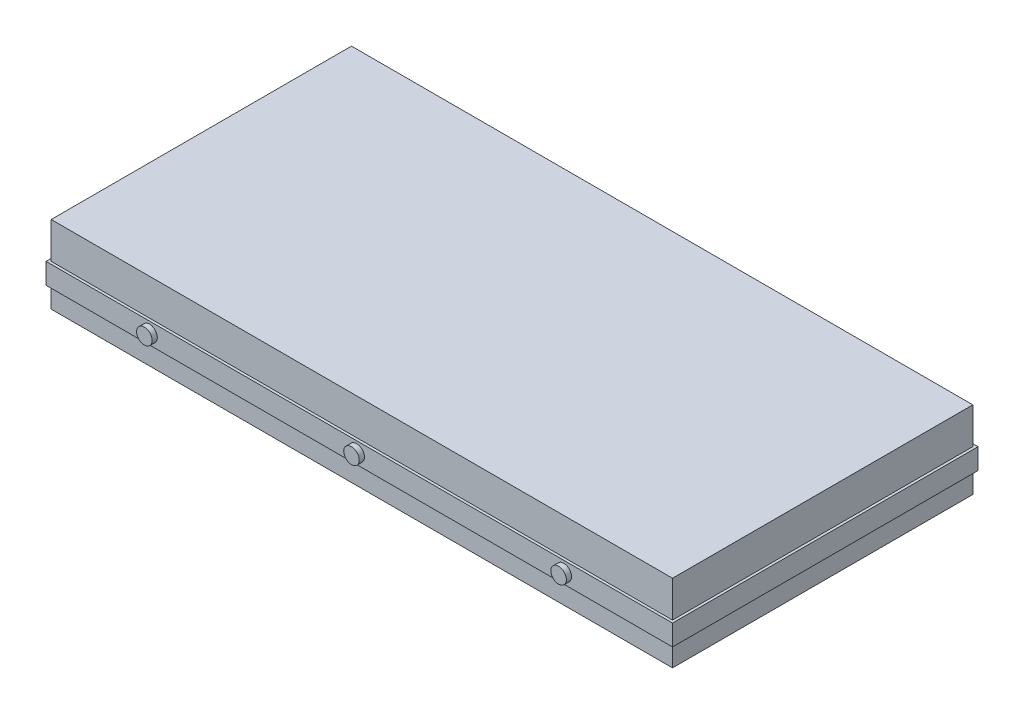
ISO-10303-21;
HEADER;
FILE_DESCRIPTION(('STEP AP214'),'2;1');
FILE_NAME('part.step','',(''),(''),'','','');
FILE_SCHEMA(('AUTOMOTIVE_DESIGN { 1 0 10303 214 1 1 1 1 }'));
ENDSEC;
DATA;
#1=APPLICATION_CONTEXT('core data for automotive mechanical design processes');
#2=APPLICATION_PROTOCOL_DEFINITION('international standard','automotive_design',2000,#1);
#3=PRODUCT_CONTEXT('',#1,'mechanical');
#4=PRODUCT('Part','Part','',(#3));
#5=PRODUCT_RELATED_PRODUCT_CATEGORY('part','',(#4));
#6=PRODUCT_DEFINITION_FORMATION('','',#4);
#7=PRODUCT_DEFINITION_CONTEXT('part definition',#1,'design');
#8=PRODUCT_DEFINITION('design','',#6,#7);
#9=PRODUCT_DEFINITION_SHAPE('','',#8);
#10=(LENGTH_UNIT() NAMED_UNIT(*) SI_UNIT(.MILLI.,.METRE.));
#11=(NAMED_UNIT(*) PLANE_ANGLE_UNIT() SI_UNIT($,.RADIAN.));
#12=(NAMED_UNIT(*) SI_UNIT($,.STERADIAN.) SOLID_ANGLE_UNIT());
#13=UNCERTAINTY_MEASURE_WITH_UNIT(LENGTH_MEASURE(1.E-05),#10,'distance_accuracy_value','');
#14=(GEOMETRIC_REPRESENTATION_CONTEXT(3) GLOBAL_UNCERTAINTY_ASSIGNED_CONTEXT((#13)) GLOBAL_UNIT_ASSIGNED_CONTEXT((#10,
#11,#12)) REPRESENTATION_CONTEXT('',''));
#15=CARTESIAN_POINT('',(0.,0.,0.));
#16=DIRECTION('',(0.,0.,1.));
#17=DIRECTION('',(1.,0.,0.));
#18=AXIS2_PLACEMENT_3D('',#15,#16,#17);
#19=CARTESIAN_POINT('',(995.,60.,15.));
#20=DIRECTION('',(0.,0.,1.));
#21=DIRECTION('',(1.,0.,0.));
#22=AXIS2_PLACEMENT_3D('',#19,#20,#21);
#23=PLANE('',#22);
#24=CARTESIAN_POINT('',(995.,60.,15.));
#25=DIRECTION('',(0.,0.,1.));
#26=DIRECTION('',(1.,0.,0.));
#27=AXIS2_PLACEMENT_3D('',#24,#25,#26);
#28=CIRCLE('',#27,15.);
#29=CARTESIAN_POINT('',(1010.,60.,15.));
#30=VERTEX_POINT('',#29);
#31=EDGE_CURVE('E11',#30,#30,#28,.T.);
#32=ORIENTED_EDGE('',*,*,#31,.T.);
#33=EDGE_LOOP('',(#32));
#34=FACE_BOUND('',#33,.T.);
#35=ADVANCED_FACE('F38',(#34),#23,.T.);
#36=CARTESIAN_POINT('',(995.,60.,15.));
#37=DIRECTION('',(0.,0.,-1.));
#38=DIRECTION('',(-1.,0.,0.));
#39=AXIS2_PLACEMENT_3D('',#36,#37,#38);
#40=CYLINDRICAL_SURFACE('',#39,15.);
#41=ORIENTED_EDGE('',*,*,#31,.F.);
#42=EDGE_LOOP('',(#41));
#43=FACE_BOUND('',#42,.T.);
#44=CARTESIAN_POINT('',(995.,60.,5.));
#45=DIRECTION('',(0.,0.,-1.));
#46=DIRECTION('',(-1.,0.,0.));
#47=AXIS2_PLACEMENT_3D('',#44,#45,#46);
#48=CIRCLE('',#47,15.);
#49=CARTESIAN_POINT('',(980.,60.,5.));
#50=VERTEX_POINT('',#49);
#51=EDGE_CURVE('E45',#50,#50,#48,.F.);
#52=ORIENTED_EDGE('',*,*,#51,.T.);
#53=EDGE_LOOP('',(#52));
#54=FACE_BOUND('',#53,.T.);
#55=ADVANCED_FACE('F165',(#43,#54),#40,.T.);
#56=CARTESIAN_POINT('',(1200.,150.,0.));
#57=DIRECTION('',(0.,0.,-1.));
#58=DIRECTION('',(-1.,0.,0.));
#59=AXIS2_PLACEMENT_3D('',#56,#57,#58);
#60=PLANE('',#59);
#61=DIRECTION('',(0.,-1.,0.));
#62=VECTOR('',#61,1.);
#63=CARTESIAN_POINT('',(0.,150.,0.));
#64=LINE('',#63,#62);
#65=CARTESIAN_POINT('',(0.,150.,0.));
#66=VERTEX_POINT('',#65);
#67=CARTESIAN_POINT('',(0.,80.,0.));
#68=VERTEX_POINT('',#67);
#69=EDGE_CURVE('E145',#66,#68,#64,.T.);
#70=ORIENTED_EDGE('',*,*,#69,.T.);
#71=DIRECTION('',(1.,0.,0.));
#72=VECTOR('',#71,1.);
#73=CARTESIAN_POINT('',(0.,80.,0.));
#74=LINE('',#73,#72);
#75=CARTESIAN_POINT('',(1200.,80.,0.));
#76=VERTEX_POINT('',#75);
#77=EDGE_CURVE('E129',#68,#76,#74,.T.);
#78=ORIENTED_EDGE('',*,*,#77,.T.);
#79=DIRECTION('',(0.,-1.,0.));
#80=VECTOR('',#79,1.);
#81=CARTESIAN_POINT('',(1200.,150.,0.));
#82=LINE('',#81,#80);
#83=CARTESIAN_POINT('',(1200.,150.,0.));
#84=VERTEX_POINT('',#83);
#85=EDGE_CURVE('E143',#84,#76,#82,.T.);
#86=ORIENTED_EDGE('',*,*,#85,.F.);
#87=DIRECTION('',(1.,0.,0.));
#88=VECTOR('',#87,1.);
#89=CARTESIAN_POINT('',(1200.,150.,0.));
#90=LINE('',#89,#88);
#91=EDGE_CURVE('E271',#66,#84,#90,.T.);
#92=ORIENTED_EDGE('',*,*,#91,.F.);
#93=EDGE_LOOP('',(#70,#78,#86,#92));
#94=FACE_BOUND('',#93,.T.);
#95=ADVANCED_FACE('F141',(#94),#60,.F.);
#96=CARTESIAN_POINT('',(1200.,150.,0.));
#97=DIRECTION('',(-1.,0.,0.));
#98=DIRECTION('',(0.,0.,1.));
#99=AXIS2_PLACEMENT_3D('',#96,#97,#98);
#100=PLANE('',#99);
#101=ORIENTED_EDGE('',*,*,#85,.T.);
#102=DIRECTION('',(0.,0.,-1.));
#103=VECTOR('',#102,1.);
#104=CARTESIAN_POINT('',(1200.,80.,-580.));
#105=LINE('',#104,#103);
#106=CARTESIAN_POINT('',(1200.,80.,-580.));
#107=VERTEX_POINT('',#106);
#108=EDGE_CURVE('E126',#76,#107,#105,.T.);
#109=ORIENTED_EDGE('',*,*,#108,.T.);
#110=DIRECTION('',(0.,-1.,0.));
#111=VECTOR('',#110,1.);
#112=CARTESIAN_POINT('',(1200.,150.,-580.));
#113=LINE('',#112,#111);
#114=CARTESIAN_POINT('',(1200.,150.,-580.));
#115=VERTEX_POINT('',#114);
#116=EDGE_CURVE('E157',#115,#107,#113,.T.);
#117=ORIENTED_EDGE('',*,*,#116,.F.);
#118=DIRECTION('',(0.,0.,-1.));
#119=VECTOR('',#118,1.);
#120=CARTESIAN_POINT('',(1200.,150.,0.));
#121=LINE('',#120,#119);
#122=EDGE_CURVE('E149',#84,#115,#121,.T.);
#123=ORIENTED_EDGE('',*,*,#122,.F.);
#124=EDGE_LOOP('',(#101,#109,#117,#123));
#125=FACE_BOUND('',#124,.T.);
#126=ADVANCED_FACE('F148',(#125),#100,.F.);
#127=CARTESIAN_POINT('',(0.,150.,-580.));
#128=DIRECTION('',(0.,0.,1.));
#129=DIRECTION('',(1.,0.,0.));
#130=AXIS2_PLACEMENT_3D('',#127,#128,#129);
#131=PLANE('',#130);
#132=ORIENTED_EDGE('',*,*,#116,.T.);
#133=DIRECTION('',(-1.,0.,0.));
#134=VECTOR('',#133,1.);
#135=CARTESIAN_POINT('',(1200.,80.,-580.));
#136=LINE('',#135,#134);
#137=CARTESIAN_POINT('',(0.,80.,-580.));
#138=VERTEX_POINT('',#137);
#139=EDGE_CURVE('E132',#107,#138,#136,.T.);
#140=ORIENTED_EDGE('',*,*,#139,.T.);
#141=DIRECTION('',(0.,-1.,0.));
#142=VECTOR('',#141,1.);
#143=CARTESIAN_POINT('',(0.,150.,-580.));
#144=LINE('',#143,#142);
#145=CARTESIAN_POINT('',(0.,150.,-580.));
#146=VERTEX_POINT('',#145);
#147=EDGE_CURVE('E291',#146,#138,#144,.T.);
#148=ORIENTED_EDGE('',*,*,#147,.F.);
#149=DIRECTION('',(-1.,0.,0.));
#150=VECTOR('',#149,1.);
#151=CARTESIAN_POINT('',(0.,150.,-580.));
#152=LINE('',#151,#150);
#153=EDGE_CURVE('E275',#115,#146,#152,.T.);
#154=ORIENTED_EDGE('',*,*,#153,.F.);
#155=EDGE_LOOP('',(#132,#140,#148,#154));
#156=FACE_BOUND('',#155,.T.);
#157=ADVANCED_FACE('F201',(#156),#131,.F.);
#158=CARTESIAN_POINT('',(0.,150.,0.));
#159=DIRECTION('',(1.,0.,0.));
#160=DIRECTION('',(0.,0.,-1.));
#161=AXIS2_PLACEMENT_3D('',#158,#159,#160);
#162=PLANE('',#161);
#163=ORIENTED_EDGE('',*,*,#147,.T.);
#164=DIRECTION('',(0.,0.,1.));
#165=VECTOR('',#164,1.);
#166=CARTESIAN_POINT('',(0.,80.,-580.));
#167=LINE('',#166,#165);
#168=EDGE_CURVE('E146',#138,#68,#167,.T.);
#169=ORIENTED_EDGE('',*,*,#168,.T.);
#170=ORIENTED_EDGE('',*,*,#69,.F.);
#171=DIRECTION('',(0.,0.,1.));
#172=VECTOR('',#171,1.);
#173=CARTESIAN_POINT('',(0.,150.,0.));
#174=LINE('',#173,#172);
#175=EDGE_CURVE('E277',#146,#66,#174,.T.);
#176=ORIENTED_EDGE('',*,*,#175,.F.);
#177=EDGE_LOOP('',(#163,#169,#170,#176));
#178=FACE_BOUND('',#177,.T.);
#179=ADVANCED_FACE('F205',(#178),#162,.F.);
#180=CARTESIAN_POINT('',(0.,150.,0.));
#181=DIRECTION('',(0.,-1.,0.));
#182=DIRECTION('',(0.,0.,-1.));
#183=AXIS2_PLACEMENT_3D('',#180,#181,#182);
#184=PLANE('',#183);
#185=ORIENTED_EDGE('',*,*,#91,.T.);
#186=ORIENTED_EDGE('',*,*,#122,.T.);
#187=ORIENTED_EDGE('',*,*,#153,.T.);
#188=ORIENTED_EDGE('',*,*,#175,.T.);
#189=EDGE_LOOP('',(#185,#186,#187,#188));
#190=FACE_BOUND('',#189,.T.);
#191=ADVANCED_FACE('F209',(#190),#184,.F.);
#192=CARTESIAN_POINT('',(0.,80.,0.));
#193=DIRECTION('',(0.,1.,0.));
#194=DIRECTION('',(0.,0.,1.));
#195=AXIS2_PLACEMENT_3D('',#192,#193,#194);
#196=PLANE('',#195);
#197=DIRECTION('',(0.,0.,-1.));
#198=VECTOR('',#197,1.);
#199=CARTESIAN_POINT('',(1205.,80.,-585.));
#200=LINE('',#199,#198);
#201=CARTESIAN_POINT('',(1205.,80.,5.));
#202=VERTEX_POINT('',#201);
#203=CARTESIAN_POINT('',(1205.,80.,-585.));
#204=VERTEX_POINT('',#203);
#205=EDGE_CURVE('E260',#202,#204,#200,.T.);
#206=ORIENTED_EDGE('',*,*,#205,.T.);
#207=DIRECTION('',(-1.,0.,0.));
#208=VECTOR('',#207,1.);
#209=CARTESIAN_POINT('',(1205.,80.,-585.));
#210=LINE('',#209,#208);
#211=CARTESIAN_POINT('',(-5.,80.,-585.));
#212=VERTEX_POINT('',#211);
#213=EDGE_CURVE('E319',#204,#212,#210,.T.);
#214=ORIENTED_EDGE('',*,*,#213,.T.);
#215=DIRECTION('',(0.,0.,1.));
#216=VECTOR('',#215,1.);
#217=CARTESIAN_POINT('',(-5.,80.,-585.));
#218=LINE('',#217,#216);
#219=CARTESIAN_POINT('',(-5.,80.,5.));
#220=VERTEX_POINT('',#219);
#221=EDGE_CURVE('E253',#212,#220,#218,.T.);
#222=ORIENTED_EDGE('',*,*,#221,.T.);
#223=DIRECTION('',(1.,0.,0.));
#224=VECTOR('',#223,1.);
#225=CARTESIAN_POINT('',(-5.,80.,5.));
#226=LINE('',#225,#224);
#227=EDGE_CURVE('E267',#220,#202,#226,.T.);
#228=ORIENTED_EDGE('',*,*,#227,.T.);
#229=EDGE_LOOP('',(#206,#214,#222,#228));
#230=FACE_BOUND('',#229,.T.);
#231=ORIENTED_EDGE('',*,*,#77,.F.);
#232=ORIENTED_EDGE('',*,*,#168,.F.);
#233=ORIENTED_EDGE('',*,*,#139,.F.);
#234=ORIENTED_EDGE('',*,*,#108,.F.);
#235=EDGE_LOOP('',(#231,#232,#233,#234));
#236=FACE_BOUND('',#235,.T.);
#237=ADVANCED_FACE('F128',(#230,#236),#196,.T.);
#238=CARTESIAN_POINT('',(0.,40.,0.));
#239=DIRECTION('',(0.,1.,0.));
#240=DIRECTION('',(0.,0.,1.));
#241=AXIS2_PLACEMENT_3D('',#238,#239,#240);
#242=PLANE('',#241);
#243=DIRECTION('',(0.,0.,-1.));
#244=VECTOR('',#243,1.);
#245=CARTESIAN_POINT('',(1205.,40.,-585.));
#246=LINE('',#245,#244);
#247=CARTESIAN_POINT('',(1205.,40.,5.));
#248=VERTEX_POINT('',#247);
#249=CARTESIAN_POINT('',(1205.,40.,-585.));
#250=VERTEX_POINT('',#249);
#251=EDGE_CURVE('E249',#248,#250,#246,.T.);
#252=ORIENTED_EDGE('',*,*,#251,.F.);
#253=DIRECTION('',(1.,0.,0.));
#254=VECTOR('',#253,1.);
#255=CARTESIAN_POINT('',(-5.,40.,5.));
#256=LINE('',#255,#254);
#257=CARTESIAN_POINT('',(-5.,40.,5.));
#258=VERTEX_POINT('',#257);
#259=EDGE_CURVE('E258',#258,#248,#256,.T.);
#260=ORIENTED_EDGE('',*,*,#259,.F.);
#261=DIRECTION('',(0.,0.,1.));
#262=VECTOR('',#261,1.);
#263=CARTESIAN_POINT('',(-5.,40.,-585.));
#264=LINE('',#263,#262);
#265=CARTESIAN_POINT('',(-5.,40.,-585.));
#266=VERTEX_POINT('',#265);
#267=EDGE_CURVE('E248',#266,#258,#264,.T.);
#268=ORIENTED_EDGE('',*,*,#267,.F.);
#269=DIRECTION('',(-1.,0.,0.));
#270=VECTOR('',#269,1.);
#271=CARTESIAN_POINT('',(1205.,40.,-585.));
#272=LINE('',#271,#270);
#273=EDGE_CURVE('E238',#250,#266,#272,.T.);
#274=ORIENTED_EDGE('',*,*,#273,.F.);
#275=EDGE_LOOP('',(#252,#260,#268,#274));
#276=FACE_BOUND('',#275,.T.);
#277=DIRECTION('',(0.,0.,1.));
#278=VECTOR('',#277,1.);
#279=CARTESIAN_POINT('',(0.,40.,-580.));
#280=LINE('',#279,#278);
#281=CARTESIAN_POINT('',(0.,40.,-580.));
#282=VERTEX_POINT('',#281);
#283=CARTESIAN_POINT('',(0.,40.,0.));
#284=VERTEX_POINT('',#283);
#285=EDGE_CURVE('E300',#282,#284,#280,.T.);
#286=ORIENTED_EDGE('',*,*,#285,.T.);
#287=DIRECTION('',(1.,0.,0.));
#288=VECTOR('',#287,1.);
#289=CARTESIAN_POINT('',(0.,40.,0.));
#290=LINE('',#289,#288);
#291=CARTESIAN_POINT('',(1200.,40.,0.));
#292=VERTEX_POINT('',#291);
#293=EDGE_CURVE('E306',#284,#292,#290,.T.);
#294=ORIENTED_EDGE('',*,*,#293,.T.);
#295=DIRECTION('',(0.,0.,-1.));
#296=VECTOR('',#295,1.);
#297=CARTESIAN_POINT('',(1200.,40.,-580.));
#298=LINE('',#297,#296);
#299=CARTESIAN_POINT('',(1200.,40.,-580.));
#300=VERTEX_POINT('',#299);
#301=EDGE_CURVE('E52',#292,#300,#298,.T.);
#302=ORIENTED_EDGE('',*,*,#301,.T.);
#303=DIRECTION('',(-1.,0.,0.));
#304=VECTOR('',#303,1.);
#305=CARTESIAN_POINT('',(1200.,40.,-580.));
#306=LINE('',#305,#304);
#307=EDGE_CURVE('E60',#300,#282,#306,.T.);
#308=ORIENTED_EDGE('',*,*,#307,.T.);
#309=EDGE_LOOP('',(#286,#294,#302,#308));
#310=FACE_BOUND('',#309,.T.);
#311=ADVANCED_FACE('F218',(#276,#310),#242,.F.);
#312=CARTESIAN_POINT('',(1205.,80.,-585.));
#313=DIRECTION('',(-1.,0.,0.));
#314=DIRECTION('',(0.,0.,1.));
#315=AXIS2_PLACEMENT_3D('',#312,#313,#314);
#316=PLANE('',#315);
#317=ORIENTED_EDGE('',*,*,#251,.T.);
#318=DIRECTION('',(0.,-1.,0.));
#319=VECTOR('',#318,1.);
#320=CARTESIAN_POINT('',(1205.,80.,-585.));
#321=LINE('',#320,#319);
#322=EDGE_CURVE('E243',#204,#250,#321,.T.);
#323=ORIENTED_EDGE('',*,*,#322,.F.);
#324=ORIENTED_EDGE('',*,*,#205,.F.);
#325=DIRECTION('',(0.,-1.,0.));
#326=VECTOR('',#325,1.);
#327=CARTESIAN_POINT('',(1205.,80.,5.));
#328=LINE('',#327,#326);
#329=EDGE_CURVE('E264',#202,#248,#328,.T.);
#330=ORIENTED_EDGE('',*,*,#329,.T.);
#331=EDGE_LOOP('',(#317,#323,#324,#330));
#332=FACE_BOUND('',#331,.T.);
#333=ADVANCED_FACE('F215',(#332),#316,.F.);
#334=CARTESIAN_POINT('',(1205.,80.,-585.));
#335=DIRECTION('',(0.,0.,1.));
#336=DIRECTION('',(1.,0.,0.));
#337=AXIS2_PLACEMENT_3D('',#334,#335,#336);
#338=PLANE('',#337);
#339=CARTESIAN_POINT('',(995.,60.,-585.));
#340=DIRECTION('',(0.,0.,1.));
#341=DIRECTION('',(1.,0.,0.));
#342=AXIS2_PLACEMENT_3D('',#339,#340,#341);
#343=CIRCLE('',#342,15.);
#344=CARTESIAN_POINT('',(1010.,60.,-585.));
#345=VERTEX_POINT('',#344);
#346=EDGE_CURVE('E227',#345,#345,#343,.T.);
#347=ORIENTED_EDGE('',*,*,#346,.T.);
#348=EDGE_LOOP('',(#347));
#349=FACE_BOUND('',#348,.T.);
#350=CARTESIAN_POINT('',(595.,60.,-585.));
#351=DIRECTION('',(0.,0.,1.));
#352=DIRECTION('',(1.,0.,0.));
#353=AXIS2_PLACEMENT_3D('',#350,#351,#352);
#354=CIRCLE('',#353,15.);
#355=CARTESIAN_POINT('',(610.,60.,-585.));
#356=VERTEX_POINT('',#355);
#357=EDGE_CURVE('E231',#356,#356,#354,.T.);
#358=ORIENTED_EDGE('',*,*,#357,.T.);
#359=EDGE_LOOP('',(#358));
#360=FACE_BOUND('',#359,.T.);
#361=CARTESIAN_POINT('',(195.,60.,-585.));
#362=DIRECTION('',(0.,0.,1.));
#363=DIRECTION('',(1.,0.,0.));
#364=AXIS2_PLACEMENT_3D('',#361,#362,#363);
#365=CIRCLE('',#364,15.);
#366=CARTESIAN_POINT('',(210.,60.,-585.));
#367=VERTEX_POINT('',#366);
#368=EDGE_CURVE('E235',#367,#367,#365,.T.);
#369=ORIENTED_EDGE('',*,*,#368,.T.);
#370=EDGE_LOOP('',(#369));
#371=FACE_BOUND('',#370,.T.);
#372=ORIENTED_EDGE('',*,*,#273,.T.);
#373=DIRECTION('',(0.,-1.,0.));
#374=VECTOR('',#373,1.);
#375=CARTESIAN_POINT('',(-5.,80.,-585.));
#376=LINE('',#375,#374);
#377=EDGE_CURVE('E240',#212,#266,#376,.T.);
#378=ORIENTED_EDGE('',*,*,#377,.F.);
#379=ORIENTED_EDGE('',*,*,#213,.F.);
#380=ORIENTED_EDGE('',*,*,#322,.T.);
#381=EDGE_LOOP('',(#372,#378,#379,#380));
#382=FACE_BOUND('',#381,.T.);
#383=ADVANCED_FACE('F180',(#349,#360,#371,#382),#338,.F.);
#384=CARTESIAN_POINT('',(-5.,80.,-585.));
#385=DIRECTION('',(1.,0.,0.));
#386=DIRECTION('',(0.,0.,-1.));
#387=AXIS2_PLACEMENT_3D('',#384,#385,#386);
#388=PLANE('',#387);
#389=ORIENTED_EDGE('',*,*,#267,.T.);
#390=DIRECTION('',(0.,-1.,0.));
#391=VECTOR('',#390,1.);
#392=CARTESIAN_POINT('',(-5.,80.,5.));
#393=LINE('',#392,#391);
#394=EDGE_CURVE('E254',#220,#258,#393,.T.);
#395=ORIENTED_EDGE('',*,*,#394,.F.);
#396=ORIENTED_EDGE('',*,*,#221,.F.);
#397=ORIENTED_EDGE('',*,*,#377,.T.);
#398=EDGE_LOOP('',(#389,#395,#396,#397));
#399=FACE_BOUND('',#398,.T.);
#400=ADVANCED_FACE('F170',(#399),#388,.F.);
#401=CARTESIAN_POINT('',(-5.,80.,5.));
#402=DIRECTION('',(0.,0.,-1.));
#403=DIRECTION('',(-1.,0.,0.));
#404=AXIS2_PLACEMENT_3D('',#401,#402,#403);
#405=PLANE('',#404);
#406=CARTESIAN_POINT('',(595.,60.,5.));
#407=DIRECTION('',(0.,0.,-1.));
#408=DIRECTION('',(-1.,0.,0.));
#409=AXIS2_PLACEMENT_3D('',#406,#407,#408);
#410=CIRCLE('',#409,15.);
#411=CARTESIAN_POINT('',(580.,60.,5.));
#412=VERTEX_POINT('',#411);
#413=EDGE_CURVE('E155',#412,#412,#410,.F.);
#414=ORIENTED_EDGE('',*,*,#413,.F.);
#415=EDGE_LOOP('',(#414));
#416=FACE_BOUND('',#415,.T.);
#417=CARTESIAN_POINT('',(195.,60.,5.));
#418=DIRECTION('',(0.,0.,-1.));
#419=DIRECTION('',(-1.,0.,0.));
#420=AXIS2_PLACEMENT_3D('',#417,#418,#419);
#421=CIRCLE('',#420,15.);
#422=CARTESIAN_POINT('',(180.,60.,5.));
#423=VERTEX_POINT('',#422);
#424=EDGE_CURVE('E151',#423,#423,#421,.F.);
#425=ORIENTED_EDGE('',*,*,#424,.F.);
#426=EDGE_LOOP('',(#425));
#427=FACE_BOUND('',#426,.T.);
#428=ORIENTED_EDGE('',*,*,#259,.T.);
#429=ORIENTED_EDGE('',*,*,#329,.F.);
#430=ORIENTED_EDGE('',*,*,#227,.F.);
#431=ORIENTED_EDGE('',*,*,#394,.T.);
#432=EDGE_LOOP('',(#428,#429,#430,#431));
#433=FACE_BOUND('',#432,.T.);
#434=ORIENTED_EDGE('',*,*,#51,.F.);
#435=EDGE_LOOP('',(#434));
#436=FACE_BOUND('',#435,.T.);
#437=ADVANCED_FACE('F167',(#416,#427,#433,#436),#405,.F.);
#438=CARTESIAN_POINT('',(0.,0.,0.));
#439=DIRECTION('',(0.,-1.,0.));
#440=DIRECTION('',(0.,0.,-1.));
#441=AXIS2_PLACEMENT_3D('',#438,#439,#440);
#442=PLANE('',#441);
#443=DIRECTION('',(1.,0.,0.));
#444=VECTOR('',#443,1.);
#445=CARTESIAN_POINT('',(1200.,0.,0.));
#446=LINE('',#445,#444);
#447=CARTESIAN_POINT('',(0.,0.,0.));
#448=VERTEX_POINT('',#447);
#449=CARTESIAN_POINT('',(1200.,0.,0.));
#450=VERTEX_POINT('',#449);
#451=EDGE_CURVE('E270',#448,#450,#446,.T.);
#452=ORIENTED_EDGE('',*,*,#451,.F.);
#453=DIRECTION('',(0.,0.,1.));
#454=VECTOR('',#453,1.);
#455=CARTESIAN_POINT('',(0.,0.,0.));
#456=LINE('',#455,#454);
#457=CARTESIAN_POINT('',(0.,0.,-580.));
#458=VERTEX_POINT('',#457);
#459=EDGE_CURVE('E273',#458,#448,#456,.T.);
#460=ORIENTED_EDGE('',*,*,#459,.F.);
#461=DIRECTION('',(-1.,0.,0.));
#462=VECTOR('',#461,1.);
#463=CARTESIAN_POINT('',(0.,0.,-580.));
#464=LINE('',#463,#462);
#465=CARTESIAN_POINT('',(1200.,0.,-580.));
#466=VERTEX_POINT('',#465);
#467=EDGE_CURVE('E285',#466,#458,#464,.T.);
#468=ORIENTED_EDGE('',*,*,#467,.F.);
#469=DIRECTION('',(0.,0.,-1.));
#470=VECTOR('',#469,1.);
#471=CARTESIAN_POINT('',(1200.,0.,0.));
#472=LINE('',#471,#470);
#473=EDGE_CURVE('E282',#450,#466,#472,.T.);
#474=ORIENTED_EDGE('',*,*,#473,.F.);
#475=EDGE_LOOP('',(#452,#460,#468,#474));
#476=FACE_BOUND('',#475,.T.);
#477=ADVANCED_FACE('F169',(#476),#442,.T.);
#478=ORIENTED_EDGE('',*,*,#285,.F.);
#479=EDGE_CURVE('E290',#282,#458,#144,.T.);
#480=ORIENTED_EDGE('',*,*,#479,.T.);
#481=ORIENTED_EDGE('',*,*,#459,.T.);
#482=EDGE_CURVE('E279',#284,#448,#64,.T.);
#483=ORIENTED_EDGE('',*,*,#482,.F.);
#484=EDGE_LOOP('',(#478,#480,#481,#483));
#485=FACE_BOUND('',#484,.T.);
#486=ADVANCED_FACE('F177',(#485),#162,.F.);
#487=ORIENTED_EDGE('',*,*,#307,.F.);
#488=EDGE_CURVE('E293',#300,#466,#113,.T.);
#489=ORIENTED_EDGE('',*,*,#488,.T.);
#490=ORIENTED_EDGE('',*,*,#467,.T.);
#491=ORIENTED_EDGE('',*,*,#479,.F.);
#492=EDGE_LOOP('',(#487,#489,#490,#491));
#493=FACE_BOUND('',#492,.T.);
#494=ADVANCED_FACE('F207',(#493),#131,.F.);
#495=ORIENTED_EDGE('',*,*,#301,.F.);
#496=EDGE_CURVE('E152',#292,#450,#82,.T.);
#497=ORIENTED_EDGE('',*,*,#496,.T.);
#498=ORIENTED_EDGE('',*,*,#473,.T.);
#499=ORIENTED_EDGE('',*,*,#488,.F.);
#500=EDGE_LOOP('',(#495,#497,#498,#499));
#501=FACE_BOUND('',#500,.T.);
#502=ADVANCED_FACE('F202',(#501),#100,.F.);
#503=ORIENTED_EDGE('',*,*,#293,.F.);
#504=ORIENTED_EDGE('',*,*,#482,.T.);
#505=ORIENTED_EDGE('',*,*,#451,.T.);
#506=ORIENTED_EDGE('',*,*,#496,.F.);
#507=EDGE_LOOP('',(#503,#504,#505,#506));
#508=FACE_BOUND('',#507,.T.);
#509=ADVANCED_FACE('F197',(#508),#60,.F.);
#510=CARTESIAN_POINT('',(195.,60.,15.));
#511=DIRECTION('',(0.,0.,-1.));
#512=DIRECTION('',(-1.,0.,0.));
#513=AXIS2_PLACEMENT_3D('',#510,#511,#512);
#514=CYLINDRICAL_SURFACE('',#513,15.);
#515=CARTESIAN_POINT('',(195.,60.,15.));
#516=DIRECTION('',(0.,0.,1.));
#517=DIRECTION('',(1.,0.,0.));
#518=AXIS2_PLACEMENT_3D('',#515,#516,#517);
#519=CIRCLE('',#518,15.);
#520=CARTESIAN_POINT('',(210.,60.,15.));
#521=VERTEX_POINT('',#520);
#522=EDGE_CURVE('E308',#521,#521,#519,.T.);
#523=ORIENTED_EDGE('',*,*,#522,.F.);
#524=EDGE_LOOP('',(#523));
#525=FACE_BOUND('',#524,.T.);
#526=ORIENTED_EDGE('',*,*,#424,.T.);
#527=EDGE_LOOP('',(#526));
#528=FACE_BOUND('',#527,.T.);
#529=ADVANCED_FACE('F378',(#525,#528),#514,.T.);
#530=CARTESIAN_POINT('',(195.,60.,15.));
#531=DIRECTION('',(0.,0.,1.));
#532=DIRECTION('',(1.,0.,0.));
#533=AXIS2_PLACEMENT_3D('',#530,#531,#532);
#534=PLANE('',#533);
#535=ORIENTED_EDGE('',*,*,#522,.T.);
#536=EDGE_LOOP('',(#535));
#537=FACE_BOUND('',#536,.T.);
#538=ADVANCED_FACE('F374',(#537),#534,.T.);
#539=CARTESIAN_POINT('',(595.,60.,15.));
#540=DIRECTION('',(0.,0.,-1.));
#541=DIRECTION('',(-1.,0.,0.));
#542=AXIS2_PLACEMENT_3D('',#539,#540,#541);
#543=CYLINDRICAL_SURFACE('',#542,15.);
#544=CARTESIAN_POINT('',(595.,60.,15.));
#545=DIRECTION('',(0.,0.,1.));
#546=DIRECTION('',(1.,0.,0.));
#547=AXIS2_PLACEMENT_3D('',#544,#545,#546);
#548=CIRCLE('',#547,15.);
#549=CARTESIAN_POINT('',(610.,60.,15.));
#550=VERTEX_POINT('',#549);
#551=EDGE_CURVE('E311',#550,#550,#548,.T.);
#552=ORIENTED_EDGE('',*,*,#551,.F.);
#553=EDGE_LOOP('',(#552));
#554=FACE_BOUND('',#553,.T.);
#555=ORIENTED_EDGE('',*,*,#413,.T.);
#556=EDGE_LOOP('',(#555));
#557=FACE_BOUND('',#556,.T.);
#558=ADVANCED_FACE('F370',(#554,#557),#543,.T.);
#559=CARTESIAN_POINT('',(595.,60.,15.));
#560=DIRECTION('',(0.,0.,1.));
#561=DIRECTION('',(1.,0.,0.));
#562=AXIS2_PLACEMENT_3D('',#559,#560,#561);
#563=PLANE('',#562);
#564=ORIENTED_EDGE('',*,*,#551,.T.);
#565=EDGE_LOOP('',(#564));
#566=FACE_BOUND('',#565,.T.);
#567=ADVANCED_FACE('F366',(#566),#563,.T.);
#568=CARTESIAN_POINT('',(195.,60.,-595.));
#569=DIRECTION('',(0.,0.,1.));
#570=DIRECTION('',(1.,0.,0.));
#571=AXIS2_PLACEMENT_3D('',#568,#569,#570);
#572=CYLINDRICAL_SURFACE('',#571,15.);
#573=CARTESIAN_POINT('',(195.,60.,-595.));
#574=DIRECTION('',(0.,0.,1.));
#575=DIRECTION('',(1.,0.,0.));
#576=AXIS2_PLACEMENT_3D('',#573,#574,#575);
#577=CIRCLE('',#576,15.);
#578=CARTESIAN_POINT('',(210.,60.,-595.));
#579=VERTEX_POINT('',#578);
#580=EDGE_CURVE('E327',#579,#579,#577,.T.);
#581=ORIENTED_EDGE('',*,*,#580,.T.);
#582=EDGE_LOOP('',(#581));
#583=FACE_BOUND('',#582,.T.);
#584=ORIENTED_EDGE('',*,*,#368,.F.);
#585=EDGE_LOOP('',(#584));
#586=FACE_BOUND('',#585,.T.);
#587=ADVANCED_FACE('F362',(#583,#586),#572,.T.);
#588=CARTESIAN_POINT('',(195.,60.,-595.));
#589=DIRECTION('',(0.,0.,-1.));
#590=DIRECTION('',(1.,0.,0.));
#591=AXIS2_PLACEMENT_3D('',#588,#589,#590);
#592=PLANE('',#591);
#593=ORIENTED_EDGE('',*,*,#580,.F.);
#594=EDGE_LOOP('',(#593));
#595=FACE_BOUND('',#594,.T.);
#596=ADVANCED_FACE('F358',(#595),#592,.T.);
#597=CARTESIAN_POINT('',(595.,60.,-595.));
#598=DIRECTION('',(0.,0.,1.));
#599=DIRECTION('',(1.,0.,0.));
#600=AXIS2_PLACEMENT_3D('',#597,#598,#599);
#601=CYLINDRICAL_SURFACE('',#600,15.);
#602=CARTESIAN_POINT('',(595.,60.,-595.));
#603=DIRECTION('',(0.,0.,1.));
#604=DIRECTION('',(1.,0.,0.));
#605=AXIS2_PLACEMENT_3D('',#602,#603,#604);
#606=CIRCLE('',#605,15.);
#607=CARTESIAN_POINT('',(610.,60.,-595.));
#608=VERTEX_POINT('',#607);
#609=EDGE_CURVE('E329',#608,#608,#606,.T.);
#610=ORIENTED_EDGE('',*,*,#609,.T.);
#611=EDGE_LOOP('',(#610));
#612=FACE_BOUND('',#611,.T.);
#613=ORIENTED_EDGE('',*,*,#357,.F.);
#614=EDGE_LOOP('',(#613));
#615=FACE_BOUND('',#614,.T.);
#616=ADVANCED_FACE('F354',(#612,#615),#601,.T.);
#617=CARTESIAN_POINT('',(595.,60.,-595.));
#618=DIRECTION('',(0.,0.,-1.));
#619=DIRECTION('',(1.,0.,0.));
#620=AXIS2_PLACEMENT_3D('',#617,#618,#619);
#621=PLANE('',#620);
#622=ORIENTED_EDGE('',*,*,#609,.F.);
#623=EDGE_LOOP('',(#622));
#624=FACE_BOUND('',#623,.T.);
#625=ADVANCED_FACE('F349',(#624),#621,.T.);
#626=CARTESIAN_POINT('',(995.,60.,-595.));
#627=DIRECTION('',(0.,0.,1.));
#628=DIRECTION('',(1.,0.,0.));
#629=AXIS2_PLACEMENT_3D('',#626,#627,#628);
#630=CYLINDRICAL_SURFACE('',#629,15.);
#631=CARTESIAN_POINT('',(995.,60.,-595.));
#632=DIRECTION('',(0.,0.,1.));
#633=DIRECTION('',(1.,0.,0.));
#634=AXIS2_PLACEMENT_3D('',#631,#632,#633);
#635=CIRCLE('',#634,15.);
#636=CARTESIAN_POINT('',(1010.,60.,-595.));
#637=VERTEX_POINT('',#636);
#638=EDGE_CURVE('E333',#637,#637,#635,.T.);
#639=ORIENTED_EDGE('',*,*,#638,.T.);
#640=EDGE_LOOP('',(#639));
#641=FACE_BOUND('',#640,.T.);
#642=ORIENTED_EDGE('',*,*,#346,.F.);
#643=EDGE_LOOP('',(#642));
#644=FACE_BOUND('',#643,.T.);
#645=ADVANCED_FACE('F340',(#641,#644),#630,.T.);
#646=CARTESIAN_POINT('',(995.,60.,-595.));
#647=DIRECTION('',(0.,0.,-1.));
#648=DIRECTION('',(1.,0.,0.));
#649=AXIS2_PLACEMENT_3D('',#646,#647,#648);
#650=PLANE('',#649);
#651=ORIENTED_EDGE('',*,*,#638,.F.);
#652=EDGE_LOOP('',(#651));
#653=FACE_BOUND('',#652,.T.);
#654=ADVANCED_FACE('F343',(#653),#650,.T.);
#655=CLOSED_SHELL('',(#35,#55,#95,#126,#157,#179,#191,#237,#311,#333,#383,#400,#437,#477,#486,
#494,#502,#509,#529,#538,#558,#567,#587,#596,#616,#625,#645,#654));
#656=MANIFOLD_SOLID_BREP('B2',#655);
#657=ADVANCED_BREP_SHAPE_REPRESENTATION('',(#18,#656),#14);
#658=SHAPE_DEFINITION_REPRESENTATION(#9,#657);
ENDSEC;
END-ISO-10303-21;
